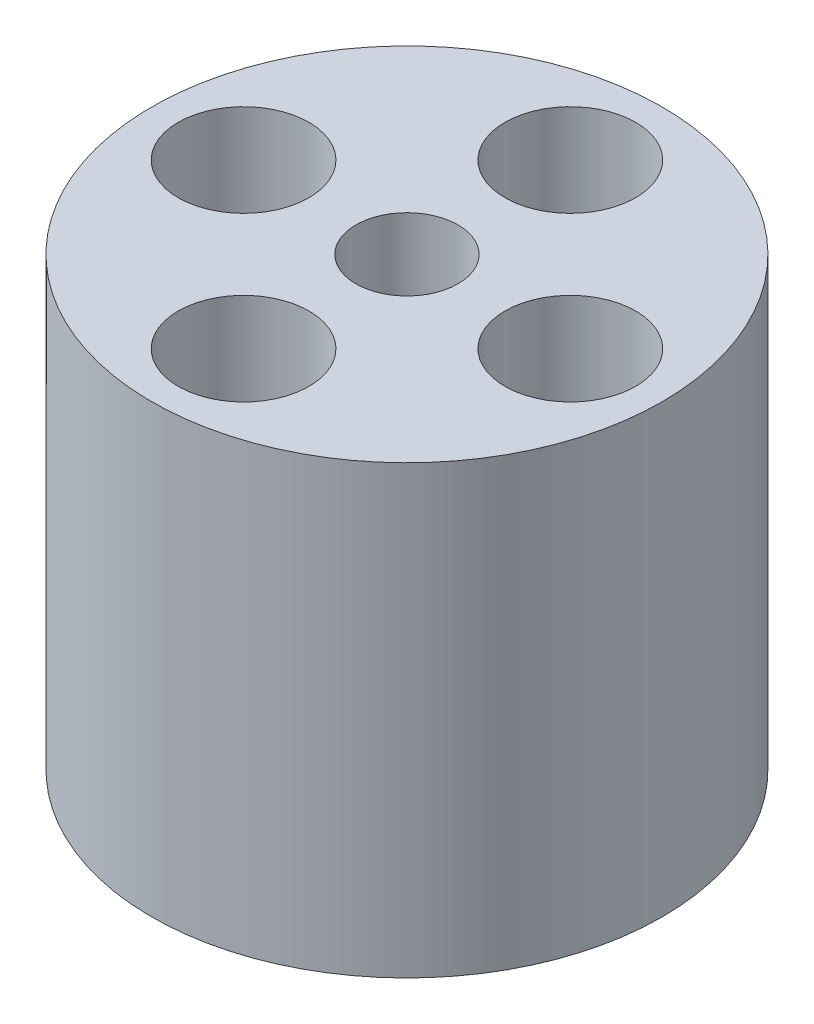
ISO-10303-21;
HEADER;
FILE_DESCRIPTION(('STEP AP214'),'2;1');
FILE_NAME('part.step','',(''),(''),'','','');
FILE_SCHEMA(('AUTOMOTIVE_DESIGN { 1 0 10303 214 1 1 1 1 }'));
ENDSEC;
DATA;
#1=APPLICATION_CONTEXT('core data for automotive mechanical design processes');
#2=APPLICATION_PROTOCOL_DEFINITION('international standard','automotive_design',2000,#1);
#3=PRODUCT_CONTEXT('',#1,'mechanical');
#4=PRODUCT('Part','Part','',(#3));
#5=PRODUCT_RELATED_PRODUCT_CATEGORY('part','',(#4));
#6=PRODUCT_DEFINITION_FORMATION('','',#4);
#7=PRODUCT_DEFINITION_CONTEXT('part definition',#1,'design');
#8=PRODUCT_DEFINITION('design','',#6,#7);
#9=PRODUCT_DEFINITION_SHAPE('','',#8);
#10=(LENGTH_UNIT() NAMED_UNIT(*) SI_UNIT(.MILLI.,.METRE.));
#11=(NAMED_UNIT(*) PLANE_ANGLE_UNIT() SI_UNIT($,.RADIAN.));
#12=(NAMED_UNIT(*) SI_UNIT($,.STERADIAN.) SOLID_ANGLE_UNIT());
#13=UNCERTAINTY_MEASURE_WITH_UNIT(LENGTH_MEASURE(1.E-05),#10,'distance_accuracy_value','');
#14=(GEOMETRIC_REPRESENTATION_CONTEXT(3) GLOBAL_UNCERTAINTY_ASSIGNED_CONTEXT((#13)) GLOBAL_UNIT_ASSIGNED_CONTEXT((#10,
#11,#12)) REPRESENTATION_CONTEXT('',''));
#15=CARTESIAN_POINT('',(0.,0.,0.));
#16=DIRECTION('',(0.,0.,1.));
#17=DIRECTION('',(1.,0.,0.));
#18=AXIS2_PLACEMENT_3D('',#15,#16,#17);
#19=CARTESIAN_POINT('',(0.,10.925,0.));
#20=DIRECTION('',(0.,-1.,0.));
#21=DIRECTION('',(-1.,0.,0.));
#22=AXIS2_PLACEMENT_3D('',#19,#20,#21);
#23=CYLINDRICAL_SURFACE('',#22,12.5);
#24=CARTESIAN_POINT('',(0.,10.925,0.));
#25=DIRECTION('',(0.,1.,0.));
#26=DIRECTION('',(1.,0.,0.));
#27=AXIS2_PLACEMENT_3D('',#24,#25,#26);
#28=CIRCLE('',#27,12.5);
#29=CARTESIAN_POINT('',(12.5,10.925,0.));
#30=VERTEX_POINT('',#29);
#31=EDGE_CURVE('E10',#30,#30,#28,.T.);
#32=ORIENTED_EDGE('',*,*,#31,.F.);
#33=EDGE_LOOP('',(#32));
#34=FACE_BOUND('',#33,.T.);
#35=CARTESIAN_POINT('',(0.,-10.925,0.));
#36=DIRECTION('',(0.,1.,0.));
#37=DIRECTION('',(1.,0.,0.));
#38=AXIS2_PLACEMENT_3D('',#35,#36,#37);
#39=CIRCLE('',#38,12.5);
#40=CARTESIAN_POINT('',(12.5,-10.925,0.));
#41=VERTEX_POINT('',#40);
#42=EDGE_CURVE('E23',#41,#41,#39,.T.);
#43=ORIENTED_EDGE('',*,*,#42,.T.);
#44=EDGE_LOOP('',(#43));
#45=FACE_BOUND('',#44,.T.);
#46=ADVANCED_FACE('F15',(#34,#45),#23,.T.);
#47=CARTESIAN_POINT('',(0.,10.925,0.));
#48=DIRECTION('',(0.,1.,0.));
#49=DIRECTION('',(1.,0.,0.));
#50=AXIS2_PLACEMENT_3D('',#47,#48,#49);
#51=PLANE('',#50);
#52=CARTESIAN_POINT('',(0.,10.925,-8.));
#53=DIRECTION('',(0.,-1.,0.));
#54=DIRECTION('',(-1.,0.,0.));
#55=AXIS2_PLACEMENT_3D('',#52,#53,#54);
#56=CIRCLE('',#55,3.2);
#57=CARTESIAN_POINT('',(-3.2,10.925,-8.));
#58=VERTEX_POINT('',#57);
#59=EDGE_CURVE('E31',#58,#58,#56,.T.);
#60=ORIENTED_EDGE('',*,*,#59,.T.);
#61=EDGE_LOOP('',(#60));
#62=FACE_BOUND('',#61,.T.);
#63=CARTESIAN_POINT('',(8.,10.925,0.));
#64=DIRECTION('',(0.,-1.,0.));
#65=DIRECTION('',(-1.,0.,0.));
#66=AXIS2_PLACEMENT_3D('',#63,#64,#65);
#67=CIRCLE('',#66,3.2);
#68=CARTESIAN_POINT('',(4.8,10.925,0.));
#69=VERTEX_POINT('',#68);
#70=EDGE_CURVE('E37',#69,#69,#67,.T.);
#71=ORIENTED_EDGE('',*,*,#70,.T.);
#72=EDGE_LOOP('',(#71));
#73=FACE_BOUND('',#72,.T.);
#74=CARTESIAN_POINT('',(0.,10.925,8.));
#75=DIRECTION('',(0.,-1.,0.));
#76=DIRECTION('',(-1.,0.,0.));
#77=AXIS2_PLACEMENT_3D('',#74,#75,#76);
#78=CIRCLE('',#77,3.2);
#79=CARTESIAN_POINT('',(-3.2,10.925,8.));
#80=VERTEX_POINT('',#79);
#81=EDGE_CURVE('E43',#80,#80,#78,.T.);
#82=ORIENTED_EDGE('',*,*,#81,.T.);
#83=EDGE_LOOP('',(#82));
#84=FACE_BOUND('',#83,.T.);
#85=CARTESIAN_POINT('',(-8.,10.925,0.));
#86=DIRECTION('',(0.,-1.,0.));
#87=DIRECTION('',(-1.,0.,0.));
#88=AXIS2_PLACEMENT_3D('',#85,#86,#87);
#89=CIRCLE('',#88,3.2);
#90=CARTESIAN_POINT('',(-11.2,10.925,0.));
#91=VERTEX_POINT('',#90);
#92=EDGE_CURVE('E47',#91,#91,#89,.T.);
#93=ORIENTED_EDGE('',*,*,#92,.T.);
#94=EDGE_LOOP('',(#93));
#95=FACE_BOUND('',#94,.T.);
#96=CARTESIAN_POINT('',(0.,10.925,0.));
#97=DIRECTION('',(0.,1.,0.));
#98=DIRECTION('',(1.,0.,0.));
#99=AXIS2_PLACEMENT_3D('',#96,#97,#98);
#100=CIRCLE('',#99,2.5);
#101=CARTESIAN_POINT('',(2.5,10.925,0.));
#102=VERTEX_POINT('',#101);
#103=EDGE_CURVE('E51',#102,#102,#100,.T.);
#104=ORIENTED_EDGE('',*,*,#103,.F.);
#105=EDGE_LOOP('',(#104));
#106=FACE_BOUND('',#105,.T.);
#107=ORIENTED_EDGE('',*,*,#31,.T.);
#108=EDGE_LOOP('',(#107));
#109=FACE_BOUND('',#108,.T.);
#110=ADVANCED_FACE('F91',(#62,#73,#84,#95,#106,#109),#51,.T.);
#111=CARTESIAN_POINT('',(0.,-10.925,0.));
#112=DIRECTION('',(0.,1.,0.));
#113=DIRECTION('',(1.,0.,0.));
#114=AXIS2_PLACEMENT_3D('',#111,#112,#113);
#115=PLANE('',#114);
#116=CARTESIAN_POINT('',(0.,-10.925,-8.));
#117=DIRECTION('',(0.,1.,0.));
#118=DIRECTION('',(1.,0.,0.));
#119=AXIS2_PLACEMENT_3D('',#116,#117,#118);
#120=CIRCLE('',#119,3.2);
#121=CARTESIAN_POINT('',(3.2,-10.925,-8.));
#122=VERTEX_POINT('',#121);
#123=EDGE_CURVE('E55',#122,#122,#120,.F.);
#124=ORIENTED_EDGE('',*,*,#123,.F.);
#125=EDGE_LOOP('',(#124));
#126=FACE_BOUND('',#125,.T.);
#127=CARTESIAN_POINT('',(8.,-10.925,0.));
#128=DIRECTION('',(0.,1.,0.));
#129=DIRECTION('',(1.,0.,0.));
#130=AXIS2_PLACEMENT_3D('',#127,#128,#129);
#131=CIRCLE('',#130,3.2);
#132=CARTESIAN_POINT('',(11.2,-10.925,0.));
#133=VERTEX_POINT('',#132);
#134=EDGE_CURVE('E59',#133,#133,#131,.F.);
#135=ORIENTED_EDGE('',*,*,#134,.F.);
#136=EDGE_LOOP('',(#135));
#137=FACE_BOUND('',#136,.T.);
#138=CARTESIAN_POINT('',(0.,-10.925,8.));
#139=DIRECTION('',(0.,1.,0.));
#140=DIRECTION('',(1.,0.,0.));
#141=AXIS2_PLACEMENT_3D('',#138,#139,#140);
#142=CIRCLE('',#141,3.2);
#143=CARTESIAN_POINT('',(3.2,-10.925,8.));
#144=VERTEX_POINT('',#143);
#145=EDGE_CURVE('E63',#144,#144,#142,.F.);
#146=ORIENTED_EDGE('',*,*,#145,.F.);
#147=EDGE_LOOP('',(#146));
#148=FACE_BOUND('',#147,.T.);
#149=CARTESIAN_POINT('',(-8.,-10.925,0.));
#150=DIRECTION('',(0.,1.,0.));
#151=DIRECTION('',(1.,0.,0.));
#152=AXIS2_PLACEMENT_3D('',#149,#150,#151);
#153=CIRCLE('',#152,3.2);
#154=CARTESIAN_POINT('',(-4.8,-10.925,0.));
#155=VERTEX_POINT('',#154);
#156=EDGE_CURVE('E67',#155,#155,#153,.F.);
#157=ORIENTED_EDGE('',*,*,#156,.F.);
#158=EDGE_LOOP('',(#157));
#159=FACE_BOUND('',#158,.T.);
#160=CARTESIAN_POINT('',(0.,-10.925,0.));
#161=DIRECTION('',(0.,1.,0.));
#162=DIRECTION('',(1.,0.,0.));
#163=AXIS2_PLACEMENT_3D('',#160,#161,#162);
#164=CIRCLE('',#163,2.5);
#165=CARTESIAN_POINT('',(2.5,-10.925,0.));
#166=VERTEX_POINT('',#165);
#167=EDGE_CURVE('E71',#166,#166,#164,.T.);
#168=ORIENTED_EDGE('',*,*,#167,.T.);
#169=EDGE_LOOP('',(#168));
#170=FACE_BOUND('',#169,.T.);
#171=ORIENTED_EDGE('',*,*,#42,.F.);
#172=EDGE_LOOP('',(#171));
#173=FACE_BOUND('',#172,.T.);
#174=ADVANCED_FACE('F75',(#126,#137,#148,#159,#170,#173),#115,.F.);
#175=CARTESIAN_POINT('',(0.,-30.6472725557686,0.));
#176=DIRECTION('',(0.,1.,0.));
#177=DIRECTION('',(1.,0.,0.));
#178=AXIS2_PLACEMENT_3D('',#175,#176,#177);
#179=CYLINDRICAL_SURFACE('',#178,2.5);
#180=ORIENTED_EDGE('',*,*,#103,.T.);
#181=EDGE_LOOP('',(#180));
#182=FACE_BOUND('',#181,.T.);
#183=ORIENTED_EDGE('',*,*,#167,.F.);
#184=EDGE_LOOP('',(#183));
#185=FACE_BOUND('',#184,.T.);
#186=ADVANCED_FACE('F78',(#182,#185),#179,.F.);
#187=CARTESIAN_POINT('',(-8.,10.925,0.));
#188=DIRECTION('',(0.,-1.,0.));
#189=DIRECTION('',(-1.,0.,0.));
#190=AXIS2_PLACEMENT_3D('',#187,#188,#189);
#191=CYLINDRICAL_SURFACE('',#190,3.2);
#192=ORIENTED_EDGE('',*,*,#92,.F.);
#193=EDGE_LOOP('',(#192));
#194=FACE_BOUND('',#193,.T.);
#195=ORIENTED_EDGE('',*,*,#156,.T.);
#196=EDGE_LOOP('',(#195));
#197=FACE_BOUND('',#196,.T.);
#198=ADVANCED_FACE('F80',(#194,#197),#191,.F.);
#199=CARTESIAN_POINT('',(0.,10.925,8.));
#200=DIRECTION('',(0.,-1.,0.));
#201=DIRECTION('',(-1.,0.,0.));
#202=AXIS2_PLACEMENT_3D('',#199,#200,#201);
#203=CYLINDRICAL_SURFACE('',#202,3.2);
#204=ORIENTED_EDGE('',*,*,#81,.F.);
#205=EDGE_LOOP('',(#204));
#206=FACE_BOUND('',#205,.T.);
#207=ORIENTED_EDGE('',*,*,#145,.T.);
#208=EDGE_LOOP('',(#207));
#209=FACE_BOUND('',#208,.T.);
#210=ADVANCED_FACE('F87',(#206,#209),#203,.F.);
#211=CARTESIAN_POINT('',(8.,10.925,0.));
#212=DIRECTION('',(0.,-1.,0.));
#213=DIRECTION('',(-1.,0.,0.));
#214=AXIS2_PLACEMENT_3D('',#211,#212,#213);
#215=CYLINDRICAL_SURFACE('',#214,3.2);
#216=ORIENTED_EDGE('',*,*,#70,.F.);
#217=EDGE_LOOP('',(#216));
#218=FACE_BOUND('',#217,.T.);
#219=ORIENTED_EDGE('',*,*,#134,.T.);
#220=EDGE_LOOP('',(#219));
#221=FACE_BOUND('',#220,.T.);
#222=ADVANCED_FACE('F119',(#218,#221),#215,.F.);
#223=CARTESIAN_POINT('',(0.,10.925,-8.));
#224=DIRECTION('',(0.,-1.,0.));
#225=DIRECTION('',(-1.,0.,0.));
#226=AXIS2_PLACEMENT_3D('',#223,#224,#225);
#227=CYLINDRICAL_SURFACE('',#226,3.2);
#228=ORIENTED_EDGE('',*,*,#59,.F.);
#229=EDGE_LOOP('',(#228));
#230=FACE_BOUND('',#229,.T.);
#231=ORIENTED_EDGE('',*,*,#123,.T.);
#232=EDGE_LOOP('',(#231));
#233=FACE_BOUND('',#232,.T.);
#234=ADVANCED_FACE('F125',(#230,#233),#227,.F.);
#235=CLOSED_SHELL('',(#46,#110,#174,#186,#198,#210,#222,#234));
#236=MANIFOLD_SOLID_BREP('B1',#235);
#237=ADVANCED_BREP_SHAPE_REPRESENTATION('',(#18,#236),#14);
#238=SHAPE_DEFINITION_REPRESENTATION(#9,#237);
ENDSEC;
END-ISO-10303-21;
